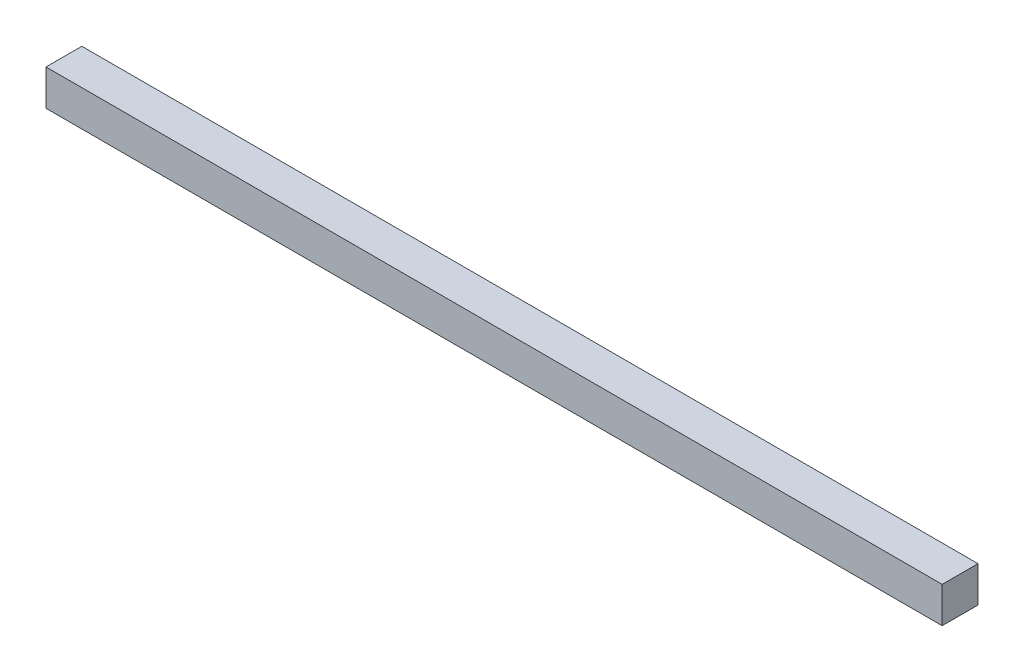
ISO-10303-21;
HEADER;
FILE_DESCRIPTION(('STEP AP214'),'2;1');
FILE_NAME('part.step','',(''),(''),'','','');
FILE_SCHEMA(('AUTOMOTIVE_DESIGN { 1 0 10303 214 1 1 1 1 }'));
ENDSEC;
DATA;
#1=APPLICATION_CONTEXT('core data for automotive mechanical design processes');
#2=APPLICATION_PROTOCOL_DEFINITION('international standard','automotive_design',2000,#1);
#3=PRODUCT_CONTEXT('',#1,'mechanical');
#4=PRODUCT('Part','Part','',(#3));
#5=PRODUCT_RELATED_PRODUCT_CATEGORY('part','',(#4));
#6=PRODUCT_DEFINITION_FORMATION('','',#4);
#7=PRODUCT_DEFINITION_CONTEXT('part definition',#1,'design');
#8=PRODUCT_DEFINITION('design','',#6,#7);
#9=PRODUCT_DEFINITION_SHAPE('','',#8);
#10=(LENGTH_UNIT() NAMED_UNIT(*) SI_UNIT(.MILLI.,.METRE.));
#11=(NAMED_UNIT(*) PLANE_ANGLE_UNIT() SI_UNIT($,.RADIAN.));
#12=(NAMED_UNIT(*) SI_UNIT($,.STERADIAN.) SOLID_ANGLE_UNIT());
#13=UNCERTAINTY_MEASURE_WITH_UNIT(LENGTH_MEASURE(1.E-05),#10,'distance_accuracy_value','');
#14=(GEOMETRIC_REPRESENTATION_CONTEXT(3) GLOBAL_UNCERTAINTY_ASSIGNED_CONTEXT((#13)) GLOBAL_UNIT_ASSIGNED_CONTEXT((#10,
#11,#12)) REPRESENTATION_CONTEXT('',''));
#15=CARTESIAN_POINT('',(0.,0.,0.));
#16=DIRECTION('',(0.,0.,1.));
#17=DIRECTION('',(1.,0.,0.));
#18=AXIS2_PLACEMENT_3D('',#15,#16,#17);
#19=CARTESIAN_POINT('',(-100.,20.,200.));
#20=DIRECTION('',(-1.,0.,0.));
#21=DIRECTION('',(0.,0.,1.));
#22=AXIS2_PLACEMENT_3D('',#19,#20,#21);
#23=PLANE('',#22);
#24=DIRECTION('',(0.,0.,-1.));
#25=VECTOR('',#24,1.);
#26=CARTESIAN_POINT('',(-100.,0.,200.));
#27=LINE('',#26,#25);
#28=CARTESIAN_POINT('',(-100.,0.,220.));
#29=VERTEX_POINT('',#28);
#30=CARTESIAN_POINT('',(-100.,0.,200.));
#31=VERTEX_POINT('',#30);
#32=EDGE_CURVE('E99',#29,#31,#27,.T.);
#33=ORIENTED_EDGE('',*,*,#32,.T.);
#34=DIRECTION('',(0.,-1.,0.));
#35=VECTOR('',#34,1.);
#36=CARTESIAN_POINT('',(-100.,20.,200.));
#37=LINE('',#36,#35);
#38=CARTESIAN_POINT('',(-100.,20.,200.));
#39=VERTEX_POINT('',#38);
#40=EDGE_CURVE('E11',#39,#31,#37,.T.);
#41=ORIENTED_EDGE('',*,*,#40,.F.);
#42=DIRECTION('',(0.,0.,-1.));
#43=VECTOR('',#42,1.);
#44=CARTESIAN_POINT('',(-100.,20.,200.));
#45=LINE('',#44,#43);
#46=CARTESIAN_POINT('',(-100.,20.,220.));
#47=VERTEX_POINT('',#46);
#48=EDGE_CURVE('E87',#47,#39,#45,.T.);
#49=ORIENTED_EDGE('',*,*,#48,.F.);
#50=DIRECTION('',(0.,-1.,0.));
#51=VECTOR('',#50,1.);
#52=CARTESIAN_POINT('',(-100.,20.,220.));
#53=LINE('',#52,#51);
#54=EDGE_CURVE('E95',#47,#29,#53,.T.);
#55=ORIENTED_EDGE('',*,*,#54,.T.);
#56=EDGE_LOOP('',(#33,#41,#49,#55));
#57=FACE_BOUND('',#56,.T.);
#58=ADVANCED_FACE('F36',(#57),#23,.F.);
#59=CARTESIAN_POINT('',(-600.,20.,200.));
#60=DIRECTION('',(0.,0.,1.));
#61=DIRECTION('',(1.,0.,0.));
#62=AXIS2_PLACEMENT_3D('',#59,#60,#61);
#63=PLANE('',#62);
#64=DIRECTION('',(-1.,0.,0.));
#65=VECTOR('',#64,1.);
#66=CARTESIAN_POINT('',(-600.,0.,200.));
#67=LINE('',#66,#65);
#68=CARTESIAN_POINT('',(-600.,0.,200.));
#69=VERTEX_POINT('',#68);
#70=EDGE_CURVE('E91',#31,#69,#67,.T.);
#71=ORIENTED_EDGE('',*,*,#70,.T.);
#72=DIRECTION('',(0.,-1.,0.));
#73=VECTOR('',#72,1.);
#74=CARTESIAN_POINT('',(-600.,20.,200.));
#75=LINE('',#74,#73);
#76=CARTESIAN_POINT('',(-600.,20.,200.));
#77=VERTEX_POINT('',#76);
#78=EDGE_CURVE('E44',#77,#69,#75,.T.);
#79=ORIENTED_EDGE('',*,*,#78,.F.);
#80=DIRECTION('',(-1.,0.,0.));
#81=VECTOR('',#80,1.);
#82=CARTESIAN_POINT('',(-600.,20.,200.));
#83=LINE('',#82,#81);
#84=EDGE_CURVE('E82',#39,#77,#83,.T.);
#85=ORIENTED_EDGE('',*,*,#84,.F.);
#86=ORIENTED_EDGE('',*,*,#40,.T.);
#87=EDGE_LOOP('',(#71,#79,#85,#86));
#88=FACE_BOUND('',#87,.T.);
#89=ADVANCED_FACE('F90',(#88),#63,.F.);
#90=CARTESIAN_POINT('',(-600.,20.,200.));
#91=DIRECTION('',(1.,0.,0.));
#92=DIRECTION('',(0.,0.,-1.));
#93=AXIS2_PLACEMENT_3D('',#90,#91,#92);
#94=PLANE('',#93);
#95=DIRECTION('',(0.,0.,1.));
#96=VECTOR('',#95,1.);
#97=CARTESIAN_POINT('',(-600.,0.,200.));
#98=LINE('',#97,#96);
#99=CARTESIAN_POINT('',(-600.,0.,220.));
#100=VERTEX_POINT('',#99);
#101=EDGE_CURVE('E69',#69,#100,#98,.T.);
#102=ORIENTED_EDGE('',*,*,#101,.T.);
#103=DIRECTION('',(0.,-1.,0.));
#104=VECTOR('',#103,1.);
#105=CARTESIAN_POINT('',(-600.,20.,220.));
#106=LINE('',#105,#104);
#107=CARTESIAN_POINT('',(-600.,20.,220.));
#108=VERTEX_POINT('',#107);
#109=EDGE_CURVE('E92',#108,#100,#106,.T.);
#110=ORIENTED_EDGE('',*,*,#109,.F.);
#111=DIRECTION('',(0.,0.,1.));
#112=VECTOR('',#111,1.);
#113=CARTESIAN_POINT('',(-600.,20.,200.));
#114=LINE('',#113,#112);
#115=EDGE_CURVE('E85',#77,#108,#114,.T.);
#116=ORIENTED_EDGE('',*,*,#115,.F.);
#117=ORIENTED_EDGE('',*,*,#78,.T.);
#118=EDGE_LOOP('',(#102,#110,#116,#117));
#119=FACE_BOUND('',#118,.T.);
#120=ADVANCED_FACE('F93',(#119),#94,.F.);
#121=CARTESIAN_POINT('',(-600.,20.,220.));
#122=DIRECTION('',(0.,0.,-1.));
#123=DIRECTION('',(-1.,0.,0.));
#124=AXIS2_PLACEMENT_3D('',#121,#122,#123);
#125=PLANE('',#124);
#126=DIRECTION('',(1.,0.,0.));
#127=VECTOR('',#126,1.);
#128=CARTESIAN_POINT('',(-600.,0.,220.));
#129=LINE('',#128,#127);
#130=EDGE_CURVE('E75',#100,#29,#129,.T.);
#131=ORIENTED_EDGE('',*,*,#130,.T.);
#132=ORIENTED_EDGE('',*,*,#54,.F.);
#133=DIRECTION('',(1.,0.,0.));
#134=VECTOR('',#133,1.);
#135=CARTESIAN_POINT('',(-600.,20.,220.));
#136=LINE('',#135,#134);
#137=EDGE_CURVE('E52',#108,#47,#136,.T.);
#138=ORIENTED_EDGE('',*,*,#137,.F.);
#139=ORIENTED_EDGE('',*,*,#109,.T.);
#140=EDGE_LOOP('',(#131,#132,#138,#139));
#141=FACE_BOUND('',#140,.T.);
#142=ADVANCED_FACE('F106',(#141),#125,.F.);
#143=CARTESIAN_POINT('',(0.,20.,0.));
#144=DIRECTION('',(0.,1.,0.));
#145=DIRECTION('',(0.,0.,1.));
#146=AXIS2_PLACEMENT_3D('',#143,#144,#145);
#147=PLANE('',#146);
#148=ORIENTED_EDGE('',*,*,#48,.T.);
#149=ORIENTED_EDGE('',*,*,#84,.T.);
#150=ORIENTED_EDGE('',*,*,#115,.T.);
#151=ORIENTED_EDGE('',*,*,#137,.T.);
#152=EDGE_LOOP('',(#148,#149,#150,#151));
#153=FACE_BOUND('',#152,.T.);
#154=ADVANCED_FACE('F83',(#153),#147,.T.);
#155=CARTESIAN_POINT('',(0.,0.,0.));
#156=DIRECTION('',(0.,1.,0.));
#157=DIRECTION('',(0.,0.,1.));
#158=AXIS2_PLACEMENT_3D('',#155,#156,#157);
#159=PLANE('',#158);
#160=ORIENTED_EDGE('',*,*,#32,.F.);
#161=ORIENTED_EDGE('',*,*,#130,.F.);
#162=ORIENTED_EDGE('',*,*,#101,.F.);
#163=ORIENTED_EDGE('',*,*,#70,.F.);
#164=EDGE_LOOP('',(#160,#161,#162,#163));
#165=FACE_BOUND('',#164,.T.);
#166=ADVANCED_FACE('F109',(#165),#159,.F.);
#167=CLOSED_SHELL('',(#58,#89,#120,#142,#154,#166));
#168=MANIFOLD_SOLID_BREP('B2',#167);
#169=ADVANCED_BREP_SHAPE_REPRESENTATION('',(#18,#168),#14);
#170=SHAPE_DEFINITION_REPRESENTATION(#9,#169);
ENDSEC;
END-ISO-10303-21;
